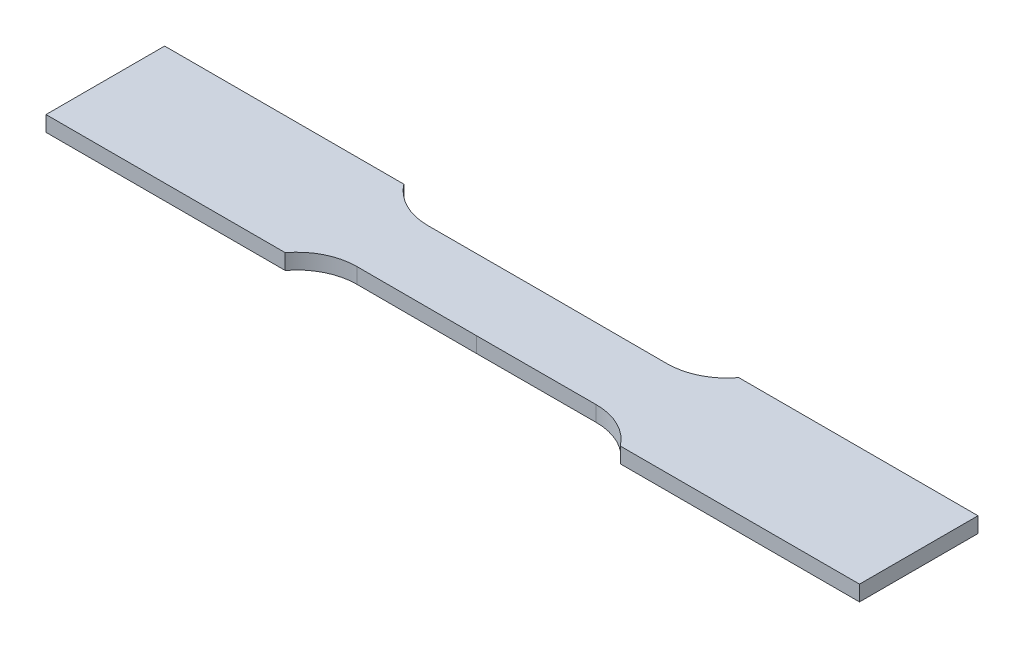
ISO-10303-21;
HEADER;
FILE_DESCRIPTION(('STEP AP214'),'2;1');
FILE_NAME('part.step','',(''),(''),'','','');
FILE_SCHEMA(('AUTOMOTIVE_DESIGN { 1 0 10303 214 1 1 1 1 }'));
ENDSEC;
DATA;
#1=APPLICATION_CONTEXT('core data for automotive mechanical design processes');
#2=APPLICATION_PROTOCOL_DEFINITION('international standard','automotive_design',2000,#1);
#3=PRODUCT_CONTEXT('',#1,'mechanical');
#4=PRODUCT('Part','Part','',(#3));
#5=PRODUCT_RELATED_PRODUCT_CATEGORY('part','',(#4));
#6=PRODUCT_DEFINITION_FORMATION('','',#4);
#7=PRODUCT_DEFINITION_CONTEXT('part definition',#1,'design');
#8=PRODUCT_DEFINITION('design','',#6,#7);
#9=PRODUCT_DEFINITION_SHAPE('','',#8);
#10=(LENGTH_UNIT() NAMED_UNIT(*) SI_UNIT(.MILLI.,.METRE.));
#11=(NAMED_UNIT(*) PLANE_ANGLE_UNIT() SI_UNIT($,.RADIAN.));
#12=(NAMED_UNIT(*) SI_UNIT($,.STERADIAN.) SOLID_ANGLE_UNIT());
#13=UNCERTAINTY_MEASURE_WITH_UNIT(LENGTH_MEASURE(1.E-05),#10,'distance_accuracy_value','');
#14=(GEOMETRIC_REPRESENTATION_CONTEXT(3) GLOBAL_UNCERTAINTY_ASSIGNED_CONTEXT((#13)) GLOBAL_UNIT_ASSIGNED_CONTEXT((#10,
#11,#12)) REPRESENTATION_CONTEXT('',''));
#15=CARTESIAN_POINT('',(0.,0.,0.));
#16=DIRECTION('',(0.,0.,1.));
#17=DIRECTION('',(1.,0.,0.));
#18=AXIS2_PLACEMENT_3D('',#15,#16,#17);
#19=CARTESIAN_POINT('',(0.,3.227,-12.3817109767229));
#20=DIRECTION('',(0.,0.,-1.));
#21=DIRECTION('',(-1.,0.,0.));
#22=AXIS2_PLACEMENT_3D('',#19,#20,#21);
#23=PLANE('',#22);
#24=DIRECTION('',(1.,0.,0.));
#25=VECTOR('',#24,1.);
#26=CARTESIAN_POINT('',(0.,0.,-12.3817109767229));
#27=LINE('',#26,#25);
#28=CARTESIAN_POINT('',(35.,0.,-12.3817109767229));
#29=VERTEX_POINT('',#28);
#30=CARTESIAN_POINT('',(85.,0.,-12.3817109767229));
#31=VERTEX_POINT('',#30);
#32=EDGE_CURVE('E168',#29,#31,#27,.T.);
#33=ORIENTED_EDGE('',*,*,#32,.F.);
#34=DIRECTION('',(0.,-1.,0.));
#35=VECTOR('',#34,1.);
#36=CARTESIAN_POINT('',(35.,3.227,-12.3817109767229));
#37=LINE('',#36,#35);
#38=CARTESIAN_POINT('',(35.,3.227,-12.3817109767229));
#39=VERTEX_POINT('',#38);
#40=EDGE_CURVE('E11',#39,#29,#37,.T.);
#41=ORIENTED_EDGE('',*,*,#40,.F.);
#42=DIRECTION('',(1.,0.,0.));
#43=VECTOR('',#42,1.);
#44=CARTESIAN_POINT('',(0.,3.227,-12.3817109767229));
#45=LINE('',#44,#43);
#46=CARTESIAN_POINT('',(85.,3.227,-12.3817109767229));
#47=VERTEX_POINT('',#46);
#48=EDGE_CURVE('E201',#39,#47,#45,.T.);
#49=ORIENTED_EDGE('',*,*,#48,.T.);
#50=DIRECTION('',(0.,-1.,0.));
#51=VECTOR('',#50,1.);
#52=CARTESIAN_POINT('',(85.,3.227,-12.3817109767229));
#53=LINE('',#52,#51);
#54=EDGE_CURVE('E53',#47,#31,#53,.T.);
#55=ORIENTED_EDGE('',*,*,#54,.T.);
#56=EDGE_LOOP('',(#33,#41,#49,#55));
#57=FACE_BOUND('',#56,.T.);
#58=ADVANCED_FACE('F37',(#57),#23,.T.);
#59=CARTESIAN_POINT('',(25.01749998285,3.227,-19.904987750018));
#60=DIRECTION('',(0.,-1.,0.));
#61=DIRECTION('',(0.,0.,-1.));
#62=AXIS2_PLACEMENT_3D('',#59,#60,#61);
#63=CYLINDRICAL_SURFACE('',#62,12.5);
#64=CARTESIAN_POINT('',(25.01749998285,0.,-19.904987750018));
#65=DIRECTION('',(0.,1.,0.));
#66=DIRECTION('',(0.,0.,1.));
#67=AXIS2_PLACEMENT_3D('',#64,#65,#66);
#68=CIRCLE('',#67,12.5);
#69=CARTESIAN_POINT('',(25.,0.,-7.40499999999999));
#70=VERTEX_POINT('',#69);
#71=EDGE_CURVE('E170',#29,#70,#68,.F.);
#72=ORIENTED_EDGE('',*,*,#71,.T.);
#73=DIRECTION('',(0.,-1.,0.));
#74=VECTOR('',#73,1.);
#75=CARTESIAN_POINT('',(25.,3.227,-7.40499999999999));
#76=LINE('',#75,#74);
#77=CARTESIAN_POINT('',(25.,3.227,-7.40499999999999));
#78=VERTEX_POINT('',#77);
#79=EDGE_CURVE('E45',#78,#70,#76,.T.);
#80=ORIENTED_EDGE('',*,*,#79,.F.);
#81=CARTESIAN_POINT('',(25.01749998285,3.227,-19.904987750018));
#82=DIRECTION('',(0.,1.,0.));
#83=DIRECTION('',(0.,0.,1.));
#84=AXIS2_PLACEMENT_3D('',#81,#82,#83);
#85=CIRCLE('',#84,12.5);
#86=EDGE_CURVE('E250',#39,#78,#85,.F.);
#87=ORIENTED_EDGE('',*,*,#86,.F.);
#88=ORIENTED_EDGE('',*,*,#40,.T.);
#89=EDGE_LOOP('',(#72,#80,#87,#88));
#90=FACE_BOUND('',#89,.T.);
#91=ADVANCED_FACE('F283',(#90),#63,.F.);
#92=CARTESIAN_POINT('',(0.0104159795846928,3.227,-7.43998541762861));
#93=DIRECTION('',(-0.00139999862800373,0.,0.999999020001441));
#94=DIRECTION('',(0.999999020001441,0.,0.00139999862800373));
#95=AXIS2_PLACEMENT_3D('',#92,#93,#94);
#96=PLANE('',#95);
#97=DIRECTION('',(-0.999999020001441,0.,-0.00139999862800373));
#98=VECTOR('',#97,1.);
#99=CARTESIAN_POINT('',(0.0104159795846928,0.,-7.43998541762861));
#100=LINE('',#99,#98);
#101=CARTESIAN_POINT('',(0.,0.,-7.44000000000003));
#102=VERTEX_POINT('',#101);
#103=EDGE_CURVE('E172',#70,#102,#100,.T.);
#104=ORIENTED_EDGE('',*,*,#103,.T.);
#105=DIRECTION('',(0.,-1.,0.));
#106=VECTOR('',#105,1.);
#107=CARTESIAN_POINT('',(0.,3.227,-7.44000000000003));
#108=LINE('',#107,#106);
#109=CARTESIAN_POINT('',(0.,3.227,-7.44000000000003));
#110=VERTEX_POINT('',#109);
#111=EDGE_CURVE('E222',#110,#102,#108,.T.);
#112=ORIENTED_EDGE('',*,*,#111,.F.);
#113=DIRECTION('',(-0.999999020001441,0.,-0.00139999862800373));
#114=VECTOR('',#113,1.);
#115=CARTESIAN_POINT('',(0.0104159795846928,3.227,-7.43998541762861));
#116=LINE('',#115,#114);
#117=EDGE_CURVE('E231',#78,#110,#116,.T.);
#118=ORIENTED_EDGE('',*,*,#117,.F.);
#119=ORIENTED_EDGE('',*,*,#79,.T.);
#120=EDGE_LOOP('',(#104,#112,#118,#119));
#121=FACE_BOUND('',#120,.T.);
#122=ADVANCED_FACE('F229',(#121),#96,.F.);
#123=CARTESIAN_POINT('',(-0.00743734868815368,3.227,-7.43999256529428));
#124=DIRECTION('',(0.000999644140347393,0.,0.999999500355672));
#125=DIRECTION('',(0.999999500355672,0.,-0.000999644140347393));
#126=AXIS2_PLACEMENT_3D('',#123,#124,#125);
#127=PLANE('',#126);
#128=DIRECTION('',(-0.999999500355672,0.,0.000999644140347393));
#129=VECTOR('',#128,1.);
#130=CARTESIAN_POINT('',(-0.00743734868815368,0.,-7.43999256529428));
#131=LINE('',#130,#129);
#132=CARTESIAN_POINT('',(-25.,0.,-7.41500888400468));
#133=VERTEX_POINT('',#132);
#134=EDGE_CURVE('E174',#102,#133,#131,.T.);
#135=ORIENTED_EDGE('',*,*,#134,.T.);
#136=DIRECTION('',(0.,-1.,0.));
#137=VECTOR('',#136,1.);
#138=CARTESIAN_POINT('',(-25.,3.227,-7.41500888400468));
#139=LINE('',#138,#137);
#140=CARTESIAN_POINT('',(-25.,3.227,-7.41500888400468));
#141=VERTEX_POINT('',#140);
#142=EDGE_CURVE('E220',#141,#133,#139,.T.);
#143=ORIENTED_EDGE('',*,*,#142,.F.);
#144=DIRECTION('',(-0.999999500355672,0.,0.000999644140347393));
#145=VECTOR('',#144,1.);
#146=CARTESIAN_POINT('',(-0.00743734868815368,3.227,-7.43999256529428));
#147=LINE('',#146,#145);
#148=EDGE_CURVE('E244',#110,#141,#147,.T.);
#149=ORIENTED_EDGE('',*,*,#148,.F.);
#150=ORIENTED_EDGE('',*,*,#111,.T.);
#151=EDGE_LOOP('',(#135,#143,#149,#150));
#152=FACE_BOUND('',#151,.T.);
#153=ADVANCED_FACE('F241',(#152),#127,.F.);
#154=CARTESIAN_POINT('',(-25.0124955517543,3.227,-19.9150026384506));
#155=DIRECTION('',(0.,-1.,0.));
#156=DIRECTION('',(0.,0.,-1.));
#157=AXIS2_PLACEMENT_3D('',#154,#155,#156);
#158=CYLINDRICAL_SURFACE('',#157,12.5);
#159=CARTESIAN_POINT('',(-25.0124955517543,0.,-19.9150026384506));
#160=DIRECTION('',(0.,1.,0.));
#161=DIRECTION('',(0.,0.,1.));
#162=AXIS2_PLACEMENT_3D('',#159,#160,#161);
#163=CIRCLE('',#162,12.5);
#164=CARTESIAN_POINT('',(-35.,0.,-12.3983707533392));
#165=VERTEX_POINT('',#164);
#166=EDGE_CURVE('E177',#165,#133,#163,.T.);
#167=ORIENTED_EDGE('',*,*,#166,.F.);
#168=DIRECTION('',(0.,-1.,0.));
#169=VECTOR('',#168,1.);
#170=CARTESIAN_POINT('',(-35.,3.227,-12.3983707533392));
#171=LINE('',#170,#169);
#172=CARTESIAN_POINT('',(-35.,3.227,-12.3983707533392));
#173=VERTEX_POINT('',#172);
#174=EDGE_CURVE('E218',#173,#165,#171,.T.);
#175=ORIENTED_EDGE('',*,*,#174,.F.);
#176=CARTESIAN_POINT('',(-25.0124955517543,3.227,-19.9150026384506));
#177=DIRECTION('',(0.,1.,0.));
#178=DIRECTION('',(0.,0.,1.));
#179=AXIS2_PLACEMENT_3D('',#176,#177,#178);
#180=CIRCLE('',#179,12.5);
#181=EDGE_CURVE('E246',#173,#141,#180,.T.);
#182=ORIENTED_EDGE('',*,*,#181,.T.);
#183=ORIENTED_EDGE('',*,*,#142,.T.);
#184=EDGE_LOOP('',(#167,#175,#182,#183));
#185=FACE_BOUND('',#184,.T.);
#186=ADVANCED_FACE('F294',(#185),#158,.F.);
#187=CARTESIAN_POINT('',(0.,3.227,-12.3983707533392));
#188=DIRECTION('',(0.,0.,1.));
#189=DIRECTION('',(1.,0.,0.));
#190=AXIS2_PLACEMENT_3D('',#187,#188,#189);
#191=PLANE('',#190);
#192=DIRECTION('',(-1.,0.,0.));
#193=VECTOR('',#192,1.);
#194=CARTESIAN_POINT('',(0.,0.,-12.3983707533392));
#195=LINE('',#194,#193);
#196=CARTESIAN_POINT('',(-85.,0.,-12.3983707533392));
#197=VERTEX_POINT('',#196);
#198=EDGE_CURVE('E180',#165,#197,#195,.T.);
#199=ORIENTED_EDGE('',*,*,#198,.T.);
#200=DIRECTION('',(0.,-1.,0.));
#201=VECTOR('',#200,1.);
#202=CARTESIAN_POINT('',(-85.,3.227,-12.3983707533392));
#203=LINE('',#202,#201);
#204=CARTESIAN_POINT('',(-85.,3.227,-12.3983707533392));
#205=VERTEX_POINT('',#204);
#206=EDGE_CURVE('E215',#205,#197,#203,.T.);
#207=ORIENTED_EDGE('',*,*,#206,.F.);
#208=DIRECTION('',(-1.,0.,0.));
#209=VECTOR('',#208,1.);
#210=CARTESIAN_POINT('',(0.,3.227,-12.3983707533392));
#211=LINE('',#210,#209);
#212=EDGE_CURVE('E248',#173,#205,#211,.T.);
#213=ORIENTED_EDGE('',*,*,#212,.F.);
#214=ORIENTED_EDGE('',*,*,#174,.T.);
#215=EDGE_LOOP('',(#199,#207,#213,#214));
#216=FACE_BOUND('',#215,.T.);
#217=ADVANCED_FACE('F297',(#216),#191,.F.);
#218=CARTESIAN_POINT('',(-85.,3.227,0.));
#219=DIRECTION('',(1.,0.,0.));
#220=DIRECTION('',(0.,0.,-1.));
#221=AXIS2_PLACEMENT_3D('',#218,#219,#220);
#222=PLANE('',#221);
#223=DIRECTION('',(0.,0.,1.));
#224=VECTOR('',#223,1.);
#225=CARTESIAN_POINT('',(-85.,0.,0.));
#226=LINE('',#225,#224);
#227=CARTESIAN_POINT('',(-85.,0.,12.3983707533392));
#228=VERTEX_POINT('',#227);
#229=EDGE_CURVE('E182',#197,#228,#226,.T.);
#230=ORIENTED_EDGE('',*,*,#229,.T.);
#231=DIRECTION('',(0.,-1.,0.));
#232=VECTOR('',#231,1.);
#233=CARTESIAN_POINT('',(-85.,3.227,12.3983707533392));
#234=LINE('',#233,#232);
#235=CARTESIAN_POINT('',(-85.,3.227,12.3983707533392));
#236=VERTEX_POINT('',#235);
#237=EDGE_CURVE('E213',#236,#228,#234,.T.);
#238=ORIENTED_EDGE('',*,*,#237,.F.);
#239=DIRECTION('',(0.,0.,1.));
#240=VECTOR('',#239,1.);
#241=CARTESIAN_POINT('',(-85.,3.227,0.));
#242=LINE('',#241,#240);
#243=EDGE_CURVE('E255',#205,#236,#242,.T.);
#244=ORIENTED_EDGE('',*,*,#243,.F.);
#245=ORIENTED_EDGE('',*,*,#206,.T.);
#246=EDGE_LOOP('',(#230,#238,#244,#245));
#247=FACE_BOUND('',#246,.T.);
#248=ADVANCED_FACE('F301',(#247),#222,.F.);
#249=CARTESIAN_POINT('',(0.,3.227,12.3983707533392));
#250=DIRECTION('',(0.,0.,1.));
#251=DIRECTION('',(1.,0.,0.));
#252=AXIS2_PLACEMENT_3D('',#249,#250,#251);
#253=PLANE('',#252);
#254=DIRECTION('',(-1.,0.,0.));
#255=VECTOR('',#254,1.);
#256=CARTESIAN_POINT('',(0.,0.,12.3983707533392));
#257=LINE('',#256,#255);
#258=CARTESIAN_POINT('',(-35.,0.,12.3983707533392));
#259=VERTEX_POINT('',#258);
#260=EDGE_CURVE('E185',#259,#228,#257,.T.);
#261=ORIENTED_EDGE('',*,*,#260,.F.);
#262=DIRECTION('',(0.,-1.,0.));
#263=VECTOR('',#262,1.);
#264=CARTESIAN_POINT('',(-35.,3.227,12.3983707533392));
#265=LINE('',#264,#263);
#266=CARTESIAN_POINT('',(-35.,3.227,12.3983707533392));
#267=VERTEX_POINT('',#266);
#268=EDGE_CURVE('E211',#267,#259,#265,.T.);
#269=ORIENTED_EDGE('',*,*,#268,.F.);
#270=DIRECTION('',(-1.,0.,0.));
#271=VECTOR('',#270,1.);
#272=CARTESIAN_POINT('',(0.,3.227,12.3983707533392));
#273=LINE('',#272,#271);
#274=EDGE_CURVE('E257',#267,#236,#273,.T.);
#275=ORIENTED_EDGE('',*,*,#274,.T.);
#276=ORIENTED_EDGE('',*,*,#237,.T.);
#277=EDGE_LOOP('',(#261,#269,#275,#276));
#278=FACE_BOUND('',#277,.T.);
#279=ADVANCED_FACE('F305',(#278),#253,.T.);
#280=CARTESIAN_POINT('',(-25.0124955517543,3.227,19.9150026384506));
#281=DIRECTION('',(0.,-1.,0.));
#282=DIRECTION('',(0.,0.,-1.));
#283=AXIS2_PLACEMENT_3D('',#280,#281,#282);
#284=CYLINDRICAL_SURFACE('',#283,12.5);
#285=CARTESIAN_POINT('',(-25.0124955517543,0.,19.9150026384506));
#286=DIRECTION('',(0.,1.,0.));
#287=DIRECTION('',(0.,0.,1.));
#288=AXIS2_PLACEMENT_3D('',#285,#286,#287);
#289=CIRCLE('',#288,12.5);
#290=CARTESIAN_POINT('',(-25.,0.,7.41500888400468));
#291=VERTEX_POINT('',#290);
#292=EDGE_CURVE('E188',#259,#291,#289,.F.);
#293=ORIENTED_EDGE('',*,*,#292,.T.);
#294=DIRECTION('',(0.,-1.,0.));
#295=VECTOR('',#294,1.);
#296=CARTESIAN_POINT('',(-25.,3.227,7.41500888400468));
#297=LINE('',#296,#295);
#298=CARTESIAN_POINT('',(-25.,3.227,7.41500888400468));
#299=VERTEX_POINT('',#298);
#300=EDGE_CURVE('E208',#299,#291,#297,.T.);
#301=ORIENTED_EDGE('',*,*,#300,.F.);
#302=CARTESIAN_POINT('',(-25.0124955517543,3.227,19.9150026384506));
#303=DIRECTION('',(0.,1.,0.));
#304=DIRECTION('',(0.,0.,1.));
#305=AXIS2_PLACEMENT_3D('',#302,#303,#304);
#306=CIRCLE('',#305,12.5);
#307=EDGE_CURVE('E260',#267,#299,#306,.F.);
#308=ORIENTED_EDGE('',*,*,#307,.F.);
#309=ORIENTED_EDGE('',*,*,#268,.T.);
#310=EDGE_LOOP('',(#293,#301,#308,#309));
#311=FACE_BOUND('',#310,.T.);
#312=ADVANCED_FACE('F309',(#311),#284,.F.);
#313=CARTESIAN_POINT('',(-0.00743734868815265,3.227,7.43999256529428));
#314=DIRECTION('',(0.000999644140347254,0.,-0.999999500355672));
#315=DIRECTION('',(-0.999999500355672,0.,-0.000999644140347254));
#316=AXIS2_PLACEMENT_3D('',#313,#314,#315);
#317=PLANE('',#316);
#318=DIRECTION('',(0.999999500355672,0.,0.000999644140347254));
#319=VECTOR('',#318,1.);
#320=CARTESIAN_POINT('',(-0.00743734868815265,0.,7.43999256529428));
#321=LINE('',#320,#319);
#322=CARTESIAN_POINT('',(0.,0.,7.44000000000003));
#323=VERTEX_POINT('',#322);
#324=EDGE_CURVE('E190',#291,#323,#321,.T.);
#325=ORIENTED_EDGE('',*,*,#324,.T.);
#326=DIRECTION('',(0.,-1.,0.));
#327=VECTOR('',#326,1.);
#328=CARTESIAN_POINT('',(0.,3.227,7.44000000000003));
#329=LINE('',#328,#327);
#330=CARTESIAN_POINT('',(0.,3.227,7.44000000000003));
#331=VERTEX_POINT('',#330);
#332=EDGE_CURVE('E205',#331,#323,#329,.T.);
#333=ORIENTED_EDGE('',*,*,#332,.F.);
#334=DIRECTION('',(0.999999500355672,0.,0.000999644140347254));
#335=VECTOR('',#334,1.);
#336=CARTESIAN_POINT('',(-0.00743734868815265,3.227,7.43999256529428));
#337=LINE('',#336,#335);
#338=EDGE_CURVE('E163',#299,#331,#337,.T.);
#339=ORIENTED_EDGE('',*,*,#338,.F.);
#340=ORIENTED_EDGE('',*,*,#300,.T.);
#341=EDGE_LOOP('',(#325,#333,#339,#340));
#342=FACE_BOUND('',#341,.T.);
#343=ADVANCED_FACE('F267',(#342),#317,.F.);
#344=CARTESIAN_POINT('',(0.0104159795846915,3.227,7.43998541762861));
#345=DIRECTION('',(-0.00139999862800356,0.,-0.999999020001441));
#346=DIRECTION('',(-0.999999020001441,0.,0.00139999862800356));
#347=AXIS2_PLACEMENT_3D('',#344,#345,#346);
#348=PLANE('',#347);
#349=DIRECTION('',(0.999999020001441,0.,-0.00139999862800356));
#350=VECTOR('',#349,1.);
#351=CARTESIAN_POINT('',(0.0104159795846915,0.,7.43998541762861));
#352=LINE('',#351,#350);
#353=CARTESIAN_POINT('',(25.,0.,7.40499999999999));
#354=VERTEX_POINT('',#353);
#355=EDGE_CURVE('E192',#323,#354,#352,.T.);
#356=ORIENTED_EDGE('',*,*,#355,.T.);
#357=DIRECTION('',(0.,-1.,0.));
#358=VECTOR('',#357,1.);
#359=CARTESIAN_POINT('',(25.,3.227,7.40499999999999));
#360=LINE('',#359,#358);
#361=CARTESIAN_POINT('',(25.,3.227,7.40499999999999));
#362=VERTEX_POINT('',#361);
#363=EDGE_CURVE('E149',#362,#354,#360,.T.);
#364=ORIENTED_EDGE('',*,*,#363,.F.);
#365=DIRECTION('',(0.999999020001441,0.,-0.00139999862800356));
#366=VECTOR('',#365,1.);
#367=CARTESIAN_POINT('',(0.0104159795846915,3.227,7.43998541762861));
#368=LINE('',#367,#366);
#369=EDGE_CURVE('E160',#331,#362,#368,.T.);
#370=ORIENTED_EDGE('',*,*,#369,.F.);
#371=ORIENTED_EDGE('',*,*,#332,.T.);
#372=EDGE_LOOP('',(#356,#364,#370,#371));
#373=FACE_BOUND('',#372,.T.);
#374=ADVANCED_FACE('F271',(#373),#348,.F.);
#375=CARTESIAN_POINT('',(25.01749998285,3.227,19.904987750018));
#376=DIRECTION('',(0.,-1.,0.));
#377=DIRECTION('',(0.,0.,-1.));
#378=AXIS2_PLACEMENT_3D('',#375,#376,#377);
#379=CYLINDRICAL_SURFACE('',#378,12.5);
#380=CARTESIAN_POINT('',(25.01749998285,0.,19.904987750018));
#381=DIRECTION('',(0.,1.,0.));
#382=DIRECTION('',(0.,0.,1.));
#383=AXIS2_PLACEMENT_3D('',#380,#381,#382);
#384=CIRCLE('',#383,12.5);
#385=CARTESIAN_POINT('',(35.,0.,12.3817109767229));
#386=VERTEX_POINT('',#385);
#387=EDGE_CURVE('E146',#386,#354,#384,.T.);
#388=ORIENTED_EDGE('',*,*,#387,.F.);
#389=DIRECTION('',(0.,-1.,0.));
#390=VECTOR('',#389,1.);
#391=CARTESIAN_POINT('',(35.,3.227,12.3817109767229));
#392=LINE('',#391,#390);
#393=CARTESIAN_POINT('',(35.,3.227,12.3817109767229));
#394=VERTEX_POINT('',#393);
#395=EDGE_CURVE('E140',#394,#386,#392,.T.);
#396=ORIENTED_EDGE('',*,*,#395,.F.);
#397=CARTESIAN_POINT('',(25.01749998285,3.227,19.904987750018));
#398=DIRECTION('',(0.,1.,0.));
#399=DIRECTION('',(0.,0.,1.));
#400=AXIS2_PLACEMENT_3D('',#397,#398,#399);
#401=CIRCLE('',#400,12.5);
#402=EDGE_CURVE('E144',#394,#362,#401,.T.);
#403=ORIENTED_EDGE('',*,*,#402,.T.);
#404=ORIENTED_EDGE('',*,*,#363,.T.);
#405=EDGE_LOOP('',(#388,#396,#403,#404));
#406=FACE_BOUND('',#405,.T.);
#407=ADVANCED_FACE('F142',(#406),#379,.F.);
#408=CARTESIAN_POINT('',(0.,3.227,12.3817109767229));
#409=DIRECTION('',(0.,0.,-1.));
#410=DIRECTION('',(-1.,0.,0.));
#411=AXIS2_PLACEMENT_3D('',#408,#409,#410);
#412=PLANE('',#411);
#413=DIRECTION('',(1.,0.,0.));
#414=VECTOR('',#413,1.);
#415=CARTESIAN_POINT('',(0.,0.,12.3817109767229));
#416=LINE('',#415,#414);
#417=CARTESIAN_POINT('',(85.,0.,12.3817109767229));
#418=VERTEX_POINT('',#417);
#419=EDGE_CURVE('E196',#386,#418,#416,.T.);
#420=ORIENTED_EDGE('',*,*,#419,.T.);
#421=DIRECTION('',(0.,-1.,0.));
#422=VECTOR('',#421,1.);
#423=CARTESIAN_POINT('',(85.,3.227,12.3817109767229));
#424=LINE('',#423,#422);
#425=CARTESIAN_POINT('',(85.,3.227,12.3817109767229));
#426=VERTEX_POINT('',#425);
#427=EDGE_CURVE('E97',#426,#418,#424,.T.);
#428=ORIENTED_EDGE('',*,*,#427,.F.);
#429=DIRECTION('',(1.,0.,0.));
#430=VECTOR('',#429,1.);
#431=CARTESIAN_POINT('',(0.,3.227,12.3817109767229));
#432=LINE('',#431,#430);
#433=EDGE_CURVE('E151',#394,#426,#432,.T.);
#434=ORIENTED_EDGE('',*,*,#433,.F.);
#435=ORIENTED_EDGE('',*,*,#395,.T.);
#436=EDGE_LOOP('',(#420,#428,#434,#435));
#437=FACE_BOUND('',#436,.T.);
#438=ADVANCED_FACE('F152',(#437),#412,.F.);
#439=CARTESIAN_POINT('',(85.,3.227,0.));
#440=DIRECTION('',(1.,0.,0.));
#441=DIRECTION('',(0.,0.,-1.));
#442=AXIS2_PLACEMENT_3D('',#439,#440,#441);
#443=PLANE('',#442);
#444=DIRECTION('',(0.,0.,1.));
#445=VECTOR('',#444,1.);
#446=CARTESIAN_POINT('',(85.,0.,0.));
#447=LINE('',#446,#445);
#448=EDGE_CURVE('E198',#31,#418,#447,.T.);
#449=ORIENTED_EDGE('',*,*,#448,.F.);
#450=ORIENTED_EDGE('',*,*,#54,.F.);
#451=DIRECTION('',(0.,0.,1.));
#452=VECTOR('',#451,1.);
#453=CARTESIAN_POINT('',(85.,3.227,0.));
#454=LINE('',#453,#452);
#455=EDGE_CURVE('E155',#47,#426,#454,.T.);
#456=ORIENTED_EDGE('',*,*,#455,.T.);
#457=ORIENTED_EDGE('',*,*,#427,.T.);
#458=EDGE_LOOP('',(#449,#450,#456,#457));
#459=FACE_BOUND('',#458,.T.);
#460=ADVANCED_FACE('F272',(#459),#443,.T.);
#461=CARTESIAN_POINT('',(0.,3.227,0.));
#462=DIRECTION('',(0.,1.,0.));
#463=DIRECTION('',(0.,0.,1.));
#464=AXIS2_PLACEMENT_3D('',#461,#462,#463);
#465=PLANE('',#464);
#466=ORIENTED_EDGE('',*,*,#48,.F.);
#467=ORIENTED_EDGE('',*,*,#86,.T.);
#468=ORIENTED_EDGE('',*,*,#117,.T.);
#469=ORIENTED_EDGE('',*,*,#148,.T.);
#470=ORIENTED_EDGE('',*,*,#181,.F.);
#471=ORIENTED_EDGE('',*,*,#212,.T.);
#472=ORIENTED_EDGE('',*,*,#243,.T.);
#473=ORIENTED_EDGE('',*,*,#274,.F.);
#474=ORIENTED_EDGE('',*,*,#307,.T.);
#475=ORIENTED_EDGE('',*,*,#338,.T.);
#476=ORIENTED_EDGE('',*,*,#369,.T.);
#477=ORIENTED_EDGE('',*,*,#402,.F.);
#478=ORIENTED_EDGE('',*,*,#433,.T.);
#479=ORIENTED_EDGE('',*,*,#455,.F.);
#480=EDGE_LOOP('',(#466,#467,#468,#469,#470,#471,#472,#473,#474,#475,#476,#477,#478,#479));
#481=FACE_BOUND('',#480,.T.);
#482=ADVANCED_FACE('F158',(#481),#465,.T.);
#483=CARTESIAN_POINT('',(0.,0.,0.));
#484=DIRECTION('',(0.,1.,0.));
#485=DIRECTION('',(0.,0.,1.));
#486=AXIS2_PLACEMENT_3D('',#483,#484,#485);
#487=PLANE('',#486);
#488=ORIENTED_EDGE('',*,*,#32,.T.);
#489=ORIENTED_EDGE('',*,*,#448,.T.);
#490=ORIENTED_EDGE('',*,*,#419,.F.);
#491=ORIENTED_EDGE('',*,*,#387,.T.);
#492=ORIENTED_EDGE('',*,*,#355,.F.);
#493=ORIENTED_EDGE('',*,*,#324,.F.);
#494=ORIENTED_EDGE('',*,*,#292,.F.);
#495=ORIENTED_EDGE('',*,*,#260,.T.);
#496=ORIENTED_EDGE('',*,*,#229,.F.);
#497=ORIENTED_EDGE('',*,*,#198,.F.);
#498=ORIENTED_EDGE('',*,*,#166,.T.);
#499=ORIENTED_EDGE('',*,*,#134,.F.);
#500=ORIENTED_EDGE('',*,*,#103,.F.);
#501=ORIENTED_EDGE('',*,*,#71,.F.);
#502=EDGE_LOOP('',(#488,#489,#490,#491,#492,#493,#494,#495,#496,#497,#498,#499,#500,#501));
#503=FACE_BOUND('',#502,.T.);
#504=ADVANCED_FACE('F236',(#503),#487,.F.);
#505=CLOSED_SHELL('',(#58,#91,#122,#153,#186,#217,#248,#279,#312,#343,#374,#407,#438,#460,#482,#504));
#506=MANIFOLD_SOLID_BREP('B2',#505);
#507=ADVANCED_BREP_SHAPE_REPRESENTATION('',(#18,#506),#14);
#508=SHAPE_DEFINITION_REPRESENTATION(#9,#507);
ENDSEC;
END-ISO-10303-21;
